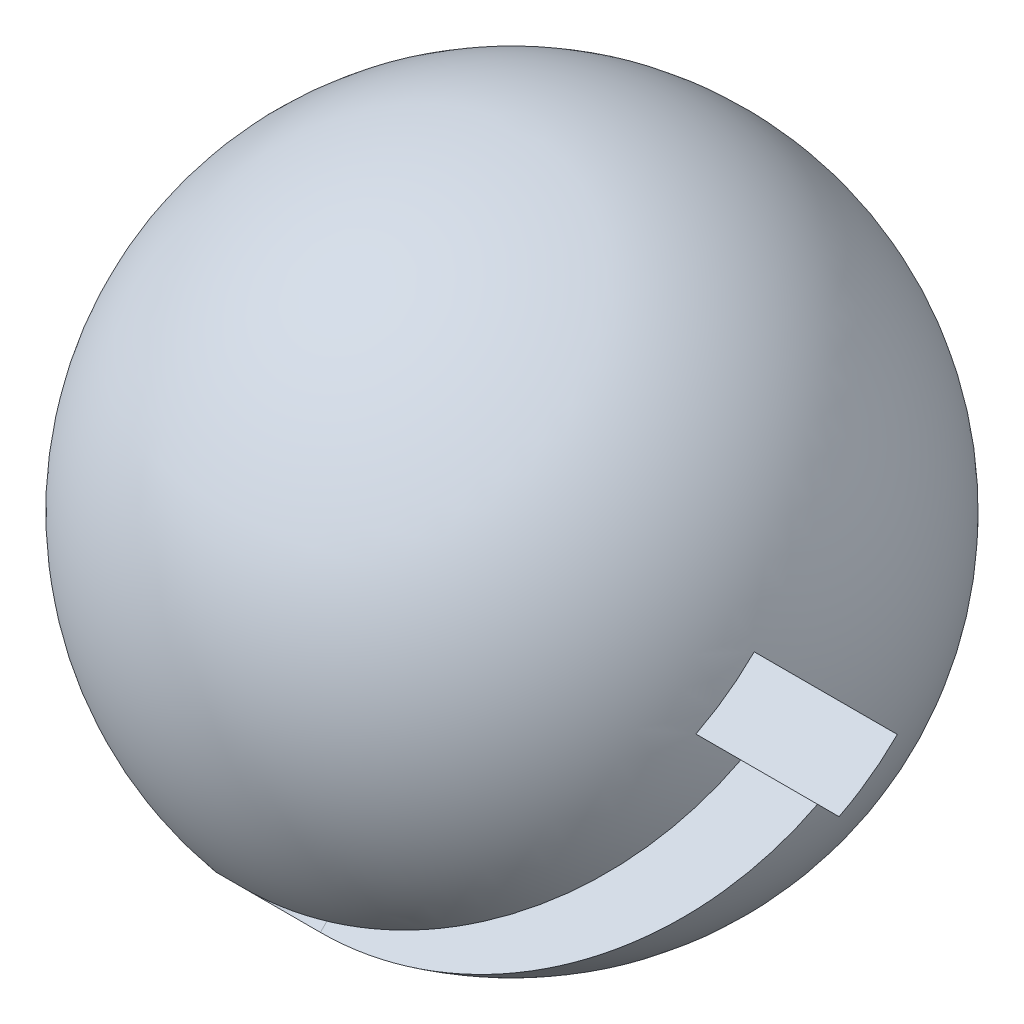
ISO-10303-21;
HEADER;
FILE_DESCRIPTION(('STEP AP214'),'2;1');
FILE_NAME('part.step','',(''),(''),'','','');
FILE_SCHEMA(('AUTOMOTIVE_DESIGN { 1 0 10303 214 1 1 1 1 }'));
ENDSEC;
DATA;
#1=APPLICATION_CONTEXT('core data for automotive mechanical design processes');
#2=APPLICATION_PROTOCOL_DEFINITION('international standard','automotive_design',2000,#1);
#3=PRODUCT_CONTEXT('',#1,'mechanical');
#4=PRODUCT('Part','Part','',(#3));
#5=PRODUCT_RELATED_PRODUCT_CATEGORY('part','',(#4));
#6=PRODUCT_DEFINITION_FORMATION('','',#4);
#7=PRODUCT_DEFINITION_CONTEXT('part definition',#1,'design');
#8=PRODUCT_DEFINITION('design','',#6,#7);
#9=PRODUCT_DEFINITION_SHAPE('','',#8);
#10=(LENGTH_UNIT() NAMED_UNIT(*) SI_UNIT(.MILLI.,.METRE.));
#11=(NAMED_UNIT(*) PLANE_ANGLE_UNIT() SI_UNIT($,.RADIAN.));
#12=(NAMED_UNIT(*) SI_UNIT($,.STERADIAN.) SOLID_ANGLE_UNIT());
#13=UNCERTAINTY_MEASURE_WITH_UNIT(LENGTH_MEASURE(1.E-05),#10,'distance_accuracy_value','');
#14=(GEOMETRIC_REPRESENTATION_CONTEXT(3) GLOBAL_UNCERTAINTY_ASSIGNED_CONTEXT((#13)) GLOBAL_UNIT_ASSIGNED_CONTEXT((#10,
#11,#12)) REPRESENTATION_CONTEXT('',''));
#15=CARTESIAN_POINT('',(0.,0.,0.));
#16=DIRECTION('',(0.,0.,1.));
#17=DIRECTION('',(1.,0.,0.));
#18=AXIS2_PLACEMENT_3D('',#15,#16,#17);
#19=CARTESIAN_POINT('',(-65.,-21.4342694425522,76.0704710401193));
#20=DIRECTION('',(0.,1.,0.));
#21=DIRECTION('',(0.,0.,-1.));
#22=AXIS2_PLACEMENT_3D('',#19,#20,#21);
#23=SPHERICAL_SURFACE('',#22,19.75);
#24=CARTESIAN_POINT('',(-65.,-35.2092467565082,89.8454483540751));
#25=DIRECTION('',(0.,0.707106781186551,-0.707106781186544));
#26=DIRECTION('',(0.,0.707106781186544,0.707106781186551));
#27=AXIS2_PLACEMENT_3D('',#24,#25,#26);
#28=CIRCLE('',#27,3.25000000000001);
#29=CARTESIAN_POINT('',(-65.,-32.9111497176519,92.1435453929314));
#30=VERTEX_POINT('',#29);
#31=CARTESIAN_POINT('',(-65.,-37.5073437953645,87.5473513152188));
#32=VERTEX_POINT('',#31);
#33=EDGE_CURVE('E92',#30,#32,#28,.F.);
#34=ORIENTED_EDGE('',*,*,#33,.F.);
#35=CARTESIAN_POINT('',(-65.,-19.136172403696,78.3685680789756));
#36=DIRECTION('',(0.,-0.707106781186544,-0.707106781186551));
#37=DIRECTION('',(0.,0.707106781186551,-0.707106781186544));
#38=AXIS2_PLACEMENT_3D('',#35,#36,#37);
#39=CIRCLE('',#38,19.4807597387782);
#40=CARTESIAN_POINT('',(-45.9884903282249,-22.1413762237388,81.3737718990184));
#41=VERTEX_POINT('',#40);
#42=EDGE_CURVE('E11',#30,#41,#39,.F.);
#43=ORIENTED_EDGE('',*,*,#42,.T.);
#44=CARTESIAN_POINT('',(-65.,-24.4394732625951,79.0756748601621));
#45=DIRECTION('',(0.,0.707106781186554,-0.707106781186541));
#46=DIRECTION('',(0.,0.707106781186541,0.707106781186554));
#47=AXIS2_PLACEMENT_3D('',#44,#45,#46);
#48=CIRCLE('',#47,19.2873015219859);
#49=CARTESIAN_POINT('',(-46.6901665763994,-20.1528662127245,83.3622819100327));
#50=VERTEX_POINT('',#49);
#51=EDGE_CURVE('E40',#41,#50,#48,.F.);
#52=ORIENTED_EDGE('',*,*,#51,.T.);
#53=CARTESIAN_POINT('',(-65.,-17.1476623926817,80.3570780899899));
#54=DIRECTION('',(0.,-0.707106781186543,-0.707106781186551));
#55=DIRECTION('',(0.,0.707106781186552,-0.707106781186544));
#56=AXIS2_PLACEMENT_3D('',#53,#54,#55);
#57=CIRCLE('',#56,18.7966087366844);
#58=CARTESIAN_POINT('',(-46.2033912633156,-17.1476623926817,80.3570780899899));
#59=VERTEX_POINT('',#58);
#60=EDGE_CURVE('E113',#50,#59,#57,.F.);
#61=ORIENTED_EDGE('',*,*,#60,.T.);
#62=CARTESIAN_POINT('',(-65.,-21.4342694425522,76.0704710401193));
#63=DIRECTION('',(0.,-0.707106781186551,0.707106781186544));
#64=DIRECTION('',(0.,-0.707106781186544,-0.707106781186551));
#65=AXIS2_PLACEMENT_3D('',#62,#63,#64);
#66=CIRCLE('',#65,19.75);
#67=CARTESIAN_POINT('',(-46.2033912633156,-25.7208764924228,71.7838639902487));
#68=VERTEX_POINT('',#67);
#69=EDGE_CURVE('E96',#59,#68,#66,.F.);
#70=ORIENTED_EDGE('',*,*,#69,.T.);
#71=CARTESIAN_POINT('',(-65.,-25.7208764924228,71.7838639902487));
#72=DIRECTION('',(0.,0.707106781186543,0.707106781186551));
#73=DIRECTION('',(0.,-0.707106781186552,0.707106781186544));
#74=AXIS2_PLACEMENT_3D('',#71,#72,#73);
#75=CIRCLE('',#74,18.7966087366844);
#76=CARTESIAN_POINT('',(-46.6901665763995,-28.7260803124656,74.7890678102915));
#77=VERTEX_POINT('',#76);
#78=EDGE_CURVE('E104',#68,#77,#75,.F.);
#79=ORIENTED_EDGE('',*,*,#78,.T.);
#80=CARTESIAN_POINT('',(-65.,-24.4394732625951,79.0756748601621));
#81=DIRECTION('',(0.,0.70710678118655,-0.707106781186545));
#82=DIRECTION('',(0.,0.707106781186545,0.70710678118655));
#83=AXIS2_PLACEMENT_3D('',#80,#81,#82);
#84=CIRCLE('',#83,19.2873015219859);
#85=CARTESIAN_POINT('',(-45.9884903282249,-26.7375703014513,76.7775778213058));
#86=VERTEX_POINT('',#85);
#87=EDGE_CURVE('E107',#77,#86,#84,.F.);
#88=ORIENTED_EDGE('',*,*,#87,.T.);
#89=CARTESIAN_POINT('',(-65.,-23.7323664814085,73.772374001263));
#90=DIRECTION('',(0.,0.707106781186544,0.707106781186551));
#91=DIRECTION('',(0.,-0.707106781186551,0.707106781186544));
#92=AXIS2_PLACEMENT_3D('',#89,#90,#91);
#93=CIRCLE('',#92,19.4807597387782);
#94=EDGE_CURVE('E110',#86,#32,#93,.F.);
#95=ORIENTED_EDGE('',*,*,#94,.T.);
#96=EDGE_LOOP('',(#34,#43,#52,#61,#70,#79,#88,#95));
#97=FACE_BOUND('',#96,.T.);
#98=ADVANCED_FACE('F33',(#97),#23,.T.);
#99=CARTESIAN_POINT('',(-70.25,-22.2961697376598,81.2189783850974));
#100=DIRECTION('',(-0.499999999999999,0.612372435695792,0.612372435695798));
#101=DIRECTION('',(0.,-0.707106781186551,0.707106781186544));
#102=AXIS2_PLACEMENT_3D('',#99,#100,#101);
#103=PLANE('',#102);
#104=DIRECTION('',(0.866025403784439,0.353553390593272,0.353553390593274));
#105=VECTOR('',#104,1.);
#106=CARTESIAN_POINT('',(-70.25,-19.290965917617,78.2137745650546));
#107=LINE('',#106,#105);
#108=CARTESIAN_POINT('',(-70.25,-19.290965917617,78.2137745650546));
#109=VERTEX_POINT('',#108);
#110=CARTESIAN_POINT('',(-65.,-17.1476623926817,80.3570780899899));
#111=VERTEX_POINT('',#110);
#112=EDGE_CURVE('E72',#109,#111,#107,.T.);
#113=ORIENTED_EDGE('',*,*,#112,.T.);
#114=DIRECTION('',(0.,0.707106781186551,-0.707106781186544));
#115=VECTOR('',#114,1.);
#116=CARTESIAN_POINT('',(-65.,-20.1528662127245,83.3622819100327));
#117=LINE('',#116,#115);
#118=CARTESIAN_POINT('',(-65.,-20.1528662127245,83.3622819100327));
#119=VERTEX_POINT('',#118);
#120=EDGE_CURVE('E76',#119,#111,#117,.T.);
#121=ORIENTED_EDGE('',*,*,#120,.F.);
#122=DIRECTION('',(0.866025403784439,0.353553390593272,0.353553390593274));
#123=VECTOR('',#122,1.);
#124=CARTESIAN_POINT('',(-70.25,-22.2961697376598,81.2189783850974));
#125=LINE('',#124,#123);
#126=CARTESIAN_POINT('',(-70.25,-22.2961697376598,81.2189783850974));
#127=VERTEX_POINT('',#126);
#128=EDGE_CURVE('E74',#127,#119,#125,.T.);
#129=ORIENTED_EDGE('',*,*,#128,.F.);
#130=DIRECTION('',(0.,0.707106781186551,-0.707106781186544));
#131=VECTOR('',#130,1.);
#132=CARTESIAN_POINT('',(-70.25,-22.2961697376598,81.2189783850974));
#133=LINE('',#132,#131);
#134=EDGE_CURVE('E56',#127,#109,#133,.T.);
#135=ORIENTED_EDGE('',*,*,#134,.T.);
#136=EDGE_LOOP('',(#113,#121,#129,#135));
#137=FACE_BOUND('',#136,.T.);
#138=ADVANCED_FACE('F69',(#137),#103,.F.);
#139=CARTESIAN_POINT('',(-70.25,-26.5827767875303,76.9323713352268));
#140=DIRECTION('',(-1.,0.,0.));
#141=DIRECTION('',(0.,0.,1.));
#142=AXIS2_PLACEMENT_3D('',#139,#140,#141);
#143=PLANE('',#142);
#144=DIRECTION('',(0.,0.707106781186542,0.707106781186553));
#145=VECTOR('',#144,1.);
#146=CARTESIAN_POINT('',(-70.25,-23.5775729674875,73.927167515184));
#147=LINE('',#146,#145);
#148=CARTESIAN_POINT('',(-70.25,-23.5775729674875,73.927167515184));
#149=VERTEX_POINT('',#148);
#150=EDGE_CURVE('E82',#149,#109,#147,.T.);
#151=ORIENTED_EDGE('',*,*,#150,.T.);
#152=ORIENTED_EDGE('',*,*,#134,.F.);
#153=DIRECTION('',(0.,0.707106781186542,0.707106781186553));
#154=VECTOR('',#153,1.);
#155=CARTESIAN_POINT('',(-70.25,-26.5827767875303,76.9323713352268));
#156=LINE('',#155,#154);
#157=CARTESIAN_POINT('',(-70.25,-26.5827767875303,76.9323713352268));
#158=VERTEX_POINT('',#157);
#159=EDGE_CURVE('E156',#158,#127,#156,.T.);
#160=ORIENTED_EDGE('',*,*,#159,.F.);
#161=DIRECTION('',(0.,0.707106781186551,-0.707106781186544));
#162=VECTOR('',#161,1.);
#163=CARTESIAN_POINT('',(-70.25,-26.5827767875303,76.9323713352268));
#164=LINE('',#163,#162);
#165=EDGE_CURVE('E77',#158,#149,#164,.T.);
#166=ORIENTED_EDGE('',*,*,#165,.T.);
#167=EDGE_LOOP('',(#151,#152,#160,#166));
#168=FACE_BOUND('',#167,.T.);
#169=ADVANCED_FACE('F89',(#168),#143,.F.);
#170=CARTESIAN_POINT('',(-65.,-28.7260803124656,74.7890678102915));
#171=DIRECTION('',(-0.500000000000001,-0.612372435695791,-0.612372435695798));
#172=DIRECTION('',(0.,0.707106781186551,-0.707106781186544));
#173=AXIS2_PLACEMENT_3D('',#170,#171,#172);
#174=PLANE('',#173);
#175=DIRECTION('',(-0.866025403784438,0.353553390593273,0.353553390593276));
#176=VECTOR('',#175,1.);
#177=CARTESIAN_POINT('',(-65.,-25.7208764924228,71.7838639902487));
#178=LINE('',#177,#176);
#179=CARTESIAN_POINT('',(-65.,-25.7208764924228,71.7838639902487));
#180=VERTEX_POINT('',#179);
#181=EDGE_CURVE('E90',#180,#149,#178,.T.);
#182=ORIENTED_EDGE('',*,*,#181,.T.);
#183=ORIENTED_EDGE('',*,*,#165,.F.);
#184=DIRECTION('',(-0.866025403784438,0.353553390593273,0.353553390593276));
#185=VECTOR('',#184,1.);
#186=CARTESIAN_POINT('',(-65.,-28.7260803124656,74.7890678102915));
#187=LINE('',#186,#185);
#188=CARTESIAN_POINT('',(-65.,-28.7260803124656,74.7890678102915));
#189=VERTEX_POINT('',#188);
#190=EDGE_CURVE('E87',#189,#158,#187,.T.);
#191=ORIENTED_EDGE('',*,*,#190,.F.);
#192=DIRECTION('',(0.,0.707106781186551,-0.707106781186544));
#193=VECTOR('',#192,1.);
#194=CARTESIAN_POINT('',(-65.,-28.7260803124656,74.7890678102915));
#195=LINE('',#194,#193);
#196=EDGE_CURVE('E99',#189,#180,#195,.T.);
#197=ORIENTED_EDGE('',*,*,#196,.T.);
#198=EDGE_LOOP('',(#182,#183,#191,#197));
#199=FACE_BOUND('',#198,.T.);
#200=ADVANCED_FACE('F213',(#199),#174,.F.);
#201=CARTESIAN_POINT('',(0.,-51.7575740613788,51.7575740613781));
#202=DIRECTION('',(0.,0.707106781186552,-0.707106781186543));
#203=DIRECTION('',(0.,0.707106781186543,0.707106781186552));
#204=AXIS2_PLACEMENT_3D('',#201,#202,#203);
#205=PLANE('',#204);
#206=CARTESIAN_POINT('',(-65.,-24.4394732625951,79.0756748601621));
#207=DIRECTION('',(0.,0.707106781186552,-0.707106781186543));
#208=DIRECTION('',(0.,0.707106781186543,0.707106781186552));
#209=AXIS2_PLACEMENT_3D('',#206,#207,#208);
#210=CIRCLE('',#209,3.25000000000001);
#211=CARTESIAN_POINT('',(-65.,-26.7375703014513,76.7775778213058));
#212=VERTEX_POINT('',#211);
#213=CARTESIAN_POINT('',(-65.,-22.1413762237388,81.3737718990184));
#214=VERTEX_POINT('',#213);
#215=EDGE_CURVE('E144',#212,#214,#210,.T.);
#216=ORIENTED_EDGE('',*,*,#215,.F.);
#217=DIRECTION('',(-1.,0.,0.));
#218=VECTOR('',#217,1.);
#219=CARTESIAN_POINT('',(-45.25,-26.7375703014513,76.7775778213058));
#220=LINE('',#219,#218);
#221=EDGE_CURVE('E142',#86,#212,#220,.T.);
#222=ORIENTED_EDGE('',*,*,#221,.F.);
#223=ORIENTED_EDGE('',*,*,#87,.F.);
#224=DIRECTION('',(-1.,0.,0.));
#225=VECTOR('',#224,1.);
#226=CARTESIAN_POINT('',(-45.25,-28.7260803124656,74.7890678102915));
#227=LINE('',#226,#225);
#228=EDGE_CURVE('E147',#77,#189,#227,.T.);
#229=ORIENTED_EDGE('',*,*,#228,.T.);
#230=ORIENTED_EDGE('',*,*,#190,.T.);
#231=ORIENTED_EDGE('',*,*,#159,.T.);
#232=ORIENTED_EDGE('',*,*,#128,.T.);
#233=DIRECTION('',(-1.,0.,0.));
#234=VECTOR('',#233,1.);
#235=CARTESIAN_POINT('',(-45.25,-20.1528662127245,83.3622819100327));
#236=LINE('',#235,#234);
#237=EDGE_CURVE('E133',#50,#119,#236,.T.);
#238=ORIENTED_EDGE('',*,*,#237,.F.);
#239=ORIENTED_EDGE('',*,*,#51,.F.);
#240=DIRECTION('',(-1.,0.,0.));
#241=VECTOR('',#240,1.);
#242=CARTESIAN_POINT('',(-45.25,-22.1413762237388,81.3737718990184));
#243=LINE('',#242,#241);
#244=EDGE_CURVE('E130',#41,#214,#243,.T.);
#245=ORIENTED_EDGE('',*,*,#244,.T.);
#246=EDGE_LOOP('',(#216,#222,#223,#229,#230,#231,#232,#238,#239,#245));
#247=FACE_BOUND('',#246,.T.);
#248=ADVANCED_FACE('F128',(#247),#205,.T.);
#249=CARTESIAN_POINT('',(0.,-48.752370241336,48.7523702413353));
#250=DIRECTION('',(0.,0.707106781186552,-0.707106781186543));
#251=DIRECTION('',(0.,0.707106781186543,0.707106781186552));
#252=AXIS2_PLACEMENT_3D('',#249,#250,#251);
#253=PLANE('',#252);
#254=ORIENTED_EDGE('',*,*,#181,.F.);
#255=DIRECTION('',(-1.,0.,0.));
#256=VECTOR('',#255,1.);
#257=CARTESIAN_POINT('',(-45.25,-25.7208764924228,71.7838639902487));
#258=LINE('',#257,#256);
#259=EDGE_CURVE('E47',#68,#180,#258,.T.);
#260=ORIENTED_EDGE('',*,*,#259,.F.);
#261=ORIENTED_EDGE('',*,*,#69,.F.);
#262=DIRECTION('',(-1.,0.,0.));
#263=VECTOR('',#262,1.);
#264=CARTESIAN_POINT('',(-45.25,-17.1476623926817,80.3570780899899));
#265=LINE('',#264,#263);
#266=EDGE_CURVE('E85',#59,#111,#265,.T.);
#267=ORIENTED_EDGE('',*,*,#266,.T.);
#268=ORIENTED_EDGE('',*,*,#112,.F.);
#269=ORIENTED_EDGE('',*,*,#150,.F.);
#270=EDGE_LOOP('',(#254,#260,#261,#267,#268,#269));
#271=FACE_BOUND('',#270,.T.);
#272=ADVANCED_FACE('F81',(#271),#253,.F.);
#273=CARTESIAN_POINT('',(-65.,-41.1842694425523,95.8204710401192));
#274=DIRECTION('',(0.,0.707106781186551,-0.707106781186544));
#275=DIRECTION('',(0.,0.707106781186544,0.707106781186551));
#276=AXIS2_PLACEMENT_3D('',#273,#274,#275);
#277=CYLINDRICAL_SURFACE('',#276,3.25000000000001);
#278=ORIENTED_EDGE('',*,*,#215,.T.);
#279=DIRECTION('',(0.,-0.707106781186551,0.707106781186544));
#280=VECTOR('',#279,1.);
#281=CARTESIAN_POINT('',(-65.,-32.9111497176519,92.1435453929314));
#282=LINE('',#281,#280);
#283=EDGE_CURVE('E140',#214,#30,#282,.T.);
#284=ORIENTED_EDGE('',*,*,#283,.T.);
#285=ORIENTED_EDGE('',*,*,#33,.T.);
#286=DIRECTION('',(0.,0.707106781186551,-0.707106781186544));
#287=VECTOR('',#286,1.);
#288=CARTESIAN_POINT('',(-65.,-26.7375703014513,76.7775778213058));
#289=LINE('',#288,#287);
#290=EDGE_CURVE('E183',#32,#212,#289,.T.);
#291=ORIENTED_EDGE('',*,*,#290,.T.);
#292=EDGE_LOOP('',(#278,#284,#285,#291));
#293=FACE_BOUND('',#292,.T.);
#294=ADVANCED_FACE('F194',(#293),#277,.F.);
#295=CARTESIAN_POINT('',(-45.25,-20.1528662127245,83.3622819100327));
#296=DIRECTION('',(0.,-0.707106781186543,-0.707106781186551));
#297=DIRECTION('',(0.,0.707106781186552,-0.707106781186544));
#298=AXIS2_PLACEMENT_3D('',#295,#296,#297);
#299=PLANE('',#298);
#300=ORIENTED_EDGE('',*,*,#237,.T.);
#301=ORIENTED_EDGE('',*,*,#120,.T.);
#302=ORIENTED_EDGE('',*,*,#266,.F.);
#303=ORIENTED_EDGE('',*,*,#60,.F.);
#304=EDGE_LOOP('',(#300,#301,#302,#303));
#305=FACE_BOUND('',#304,.T.);
#306=ADVANCED_FACE('F196',(#305),#299,.T.);
#307=CARTESIAN_POINT('',(-45.25,-32.9111497176519,92.1435453929314));
#308=DIRECTION('',(0.,-0.707106781186544,-0.707106781186551));
#309=DIRECTION('',(0.,0.707106781186551,-0.707106781186544));
#310=AXIS2_PLACEMENT_3D('',#307,#308,#309);
#311=PLANE('',#310);
#312=ORIENTED_EDGE('',*,*,#283,.F.);
#313=ORIENTED_EDGE('',*,*,#244,.F.);
#314=ORIENTED_EDGE('',*,*,#42,.F.);
#315=EDGE_LOOP('',(#312,#313,#314));
#316=FACE_BOUND('',#315,.T.);
#317=ADVANCED_FACE('F137',(#316),#311,.T.);
#318=CARTESIAN_POINT('',(-45.25,-26.7375703014513,76.7775778213058));
#319=DIRECTION('',(0.,0.707106781186544,0.707106781186551));
#320=DIRECTION('',(0.,-0.707106781186551,0.707106781186544));
#321=AXIS2_PLACEMENT_3D('',#318,#319,#320);
#322=PLANE('',#321);
#323=ORIENTED_EDGE('',*,*,#221,.T.);
#324=ORIENTED_EDGE('',*,*,#290,.F.);
#325=ORIENTED_EDGE('',*,*,#94,.F.);
#326=EDGE_LOOP('',(#323,#324,#325));
#327=FACE_BOUND('',#326,.T.);
#328=ADVANCED_FACE('F181',(#327),#322,.T.);
#329=CARTESIAN_POINT('',(-45.25,-25.7208764924228,71.7838639902487));
#330=DIRECTION('',(0.,0.707106781186543,0.707106781186551));
#331=DIRECTION('',(0.,-0.707106781186552,0.707106781186544));
#332=AXIS2_PLACEMENT_3D('',#329,#330,#331);
#333=PLANE('',#332);
#334=ORIENTED_EDGE('',*,*,#259,.T.);
#335=ORIENTED_EDGE('',*,*,#196,.F.);
#336=ORIENTED_EDGE('',*,*,#228,.F.);
#337=ORIENTED_EDGE('',*,*,#78,.F.);
#338=EDGE_LOOP('',(#334,#335,#336,#337));
#339=FACE_BOUND('',#338,.T.);
#340=ADVANCED_FACE('F186',(#339),#333,.T.);
#341=CLOSED_SHELL('',(#98,#138,#169,#200,#248,#272,#294,#306,#317,#328,#340));
#342=MANIFOLD_SOLID_BREP('B2',#341);
#343=ADVANCED_BREP_SHAPE_REPRESENTATION('',(#18,#342),#14);
#344=SHAPE_DEFINITION_REPRESENTATION(#9,#343);
ENDSEC;
END-ISO-10303-21;
